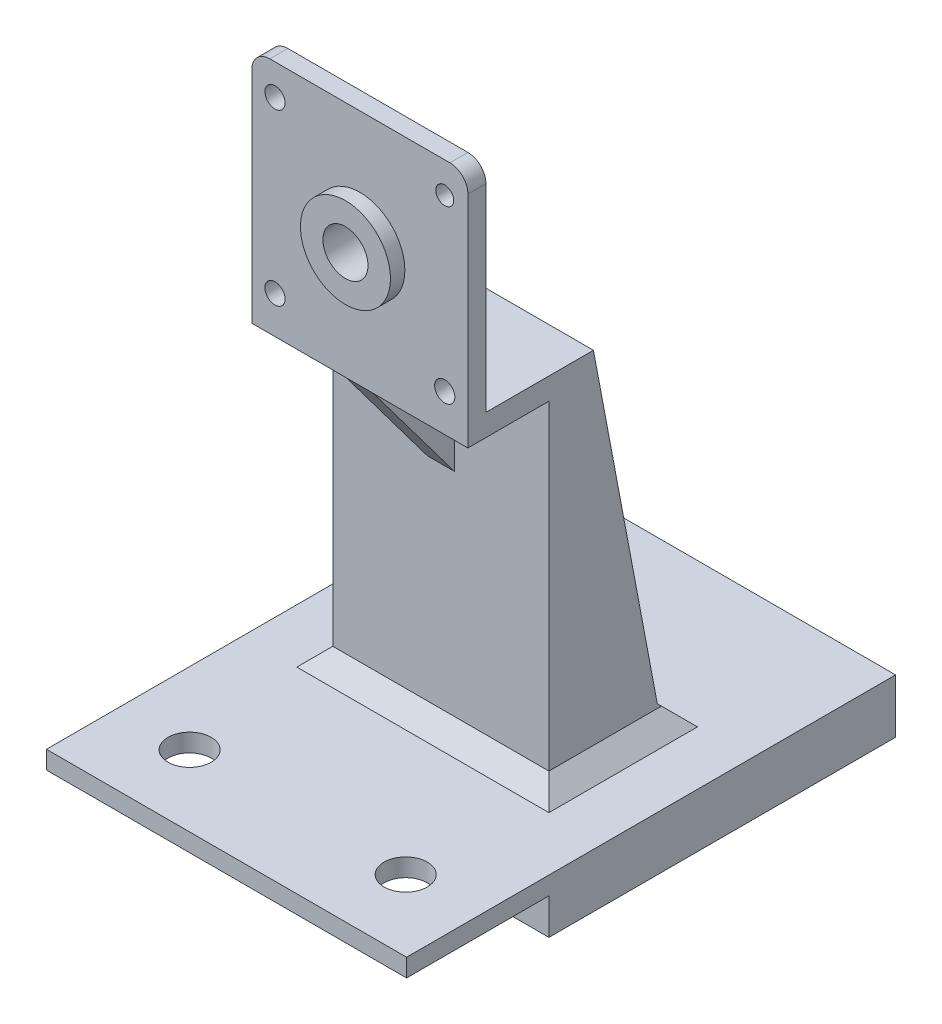
ISO-10303-21;
HEADER;
FILE_DESCRIPTION(('STEP AP214'),'2;1');
FILE_NAME('part.step','',(''),(''),'','','');
FILE_SCHEMA(('AUTOMOTIVE_DESIGN { 1 0 10303 214 1 1 1 1 }'));
ENDSEC;
DATA;
#1=APPLICATION_CONTEXT('core data for automotive mechanical design processes');
#2=APPLICATION_PROTOCOL_DEFINITION('international standard','automotive_design',2000,#1);
#3=PRODUCT_CONTEXT('',#1,'mechanical');
#4=PRODUCT('Part','Part','',(#3));
#5=PRODUCT_RELATED_PRODUCT_CATEGORY('part','',(#4));
#6=PRODUCT_DEFINITION_FORMATION('','',#4);
#7=PRODUCT_DEFINITION_CONTEXT('part definition',#1,'design');
#8=PRODUCT_DEFINITION('design','',#6,#7);
#9=PRODUCT_DEFINITION_SHAPE('','',#8);
#10=(LENGTH_UNIT() NAMED_UNIT(*) SI_UNIT(.MILLI.,.METRE.));
#11=(NAMED_UNIT(*) PLANE_ANGLE_UNIT() SI_UNIT($,.RADIAN.));
#12=(NAMED_UNIT(*) SI_UNIT($,.STERADIAN.) SOLID_ANGLE_UNIT());
#13=UNCERTAINTY_MEASURE_WITH_UNIT(LENGTH_MEASURE(1.E-05),#10,'distance_accuracy_value','');
#14=(GEOMETRIC_REPRESENTATION_CONTEXT(3) GLOBAL_UNCERTAINTY_ASSIGNED_CONTEXT((#13)) GLOBAL_UNIT_ASSIGNED_CONTEXT((#10,
#11,#12)) REPRESENTATION_CONTEXT('',''));
#15=CARTESIAN_POINT('',(0.,0.,0.));
#16=DIRECTION('',(0.,0.,1.));
#17=DIRECTION('',(1.,0.,0.));
#18=AXIS2_PLACEMENT_3D('',#15,#16,#17);
#19=CARTESIAN_POINT('',(-136.452860429321,217.859289709443,42.7777777777778));
#20=DIRECTION('',(0.,-1.,0.));
#21=DIRECTION('',(1.,0.,0.));
#22=AXIS2_PLACEMENT_3D('',#19,#20,#21);
#23=PLANE('',#22);
#24=DIRECTION('',(1.,0.,0.));
#25=VECTOR('',#24,1.);
#26=CARTESIAN_POINT('',(35.,217.859289709443,67.5));
#27=LINE('',#26,#25);
#28=CARTESIAN_POINT('',(-85.,217.859289709443,67.5));
#29=VERTEX_POINT('',#28);
#30=CARTESIAN_POINT('',(-32.5,217.859289709443,67.5));
#31=VERTEX_POINT('',#30);
#32=EDGE_CURVE('E218',#29,#31,#27,.T.);
#33=ORIENTED_EDGE('',*,*,#32,.T.);
#34=DIRECTION('',(0.,0.,1.));
#35=VECTOR('',#34,1.);
#36=CARTESIAN_POINT('',(-32.5000000000001,217.859289709443,42.7777777777778));
#37=LINE('',#36,#35);
#38=CARTESIAN_POINT('',(-32.5,217.859289709444,112.486640647303));
#39=VERTEX_POINT('',#38);
#40=EDGE_CURVE('E208',#31,#39,#37,.T.);
#41=ORIENTED_EDGE('',*,*,#40,.T.);
#42=DIRECTION('',(1.,0.,0.));
#43=VECTOR('',#42,1.);
#44=CARTESIAN_POINT('',(-218.602419857211,217.859289709443,112.486640647303));
#45=LINE('',#44,#43);
#46=CARTESIAN_POINT('',(-85.,217.859289709443,112.486640647303));
#47=VERTEX_POINT('',#46);
#48=EDGE_CURVE('E202',#47,#39,#45,.T.);
#49=ORIENTED_EDGE('',*,*,#48,.F.);
#50=DIRECTION('',(0.,0.,1.));
#51=VECTOR('',#50,1.);
#52=CARTESIAN_POINT('',(-85.,217.859289709443,42.7777777777778));
#53=LINE('',#52,#51);
#54=EDGE_CURVE('E253',#29,#47,#53,.T.);
#55=ORIENTED_EDGE('',*,*,#54,.F.);
#56=EDGE_LOOP('',(#33,#41,#49,#55));
#57=FACE_BOUND('',#56,.T.);
#58=ADVANCED_FACE('F45',(#57),#23,.T.);
#59=CARTESIAN_POINT('',(35.,0.,67.5));
#60=DIRECTION('',(0.,0.,1.));
#61=DIRECTION('',(1.,0.,0.));
#62=AXIS2_PLACEMENT_3D('',#59,#60,#61);
#63=PLANE('',#62);
#64=DIRECTION('',(0.,1.,0.));
#65=VECTOR('',#64,1.);
#66=CARTESIAN_POINT('',(-17.5000000000001,0.,67.5));
#67=LINE('',#66,#65);
#68=CARTESIAN_POINT('',(-17.5000000000001,157.859289709444,67.5));
#69=VERTEX_POINT('',#68);
#70=CARTESIAN_POINT('',(-17.5000000000001,217.859289709443,67.5));
#71=VERTEX_POINT('',#70);
#72=EDGE_CURVE('E505',#69,#71,#67,.T.);
#73=ORIENTED_EDGE('',*,*,#72,.F.);
#74=DIRECTION('',(1.,0.,0.));
#75=VECTOR('',#74,1.);
#76=CARTESIAN_POINT('',(35.,157.859289709443,67.5));
#77=LINE('',#76,#75);
#78=CARTESIAN_POINT('',(-32.5000000000001,157.859289709444,67.5));
#79=VERTEX_POINT('',#78);
#80=EDGE_CURVE('E502',#79,#69,#77,.T.);
#81=ORIENTED_EDGE('',*,*,#80,.F.);
#82=DIRECTION('',(0.,1.,0.));
#83=VECTOR('',#82,1.);
#84=CARTESIAN_POINT('',(-32.5000000000001,0.,67.5));
#85=LINE('',#84,#83);
#86=EDGE_CURVE('E210',#79,#31,#85,.T.);
#87=ORIENTED_EDGE('',*,*,#86,.T.);
#88=ORIENTED_EDGE('',*,*,#32,.F.);
#89=DIRECTION('',(0.,1.,0.));
#90=VECTOR('',#89,1.);
#91=CARTESIAN_POINT('',(-85.,0.,67.5));
#92=LINE('',#91,#90);
#93=CARTESIAN_POINT('',(-85.,40.0000000000001,67.5));
#94=VERTEX_POINT('',#93);
#95=EDGE_CURVE('E268',#94,#29,#92,.T.);
#96=ORIENTED_EDGE('',*,*,#95,.F.);
#97=DIRECTION('',(1.,0.,0.));
#98=VECTOR('',#97,1.);
#99=CARTESIAN_POINT('',(35.,40.0000000000001,67.5));
#100=LINE('',#99,#98);
#101=CARTESIAN_POINT('',(35.,40.0000000000001,67.5));
#102=VERTEX_POINT('',#101);
#103=EDGE_CURVE('E388',#94,#102,#100,.T.);
#104=ORIENTED_EDGE('',*,*,#103,.T.);
#105=DIRECTION('',(0.,1.,0.));
#106=VECTOR('',#105,1.);
#107=CARTESIAN_POINT('',(35.,0.,67.5));
#108=LINE('',#107,#106);
#109=CARTESIAN_POINT('',(34.9999999999999,217.859289709443,67.5));
#110=VERTEX_POINT('',#109);
#111=EDGE_CURVE('E272',#102,#110,#108,.T.);
#112=ORIENTED_EDGE('',*,*,#111,.T.);
#113=EDGE_CURVE('E256',#71,#110,#27,.T.);
#114=ORIENTED_EDGE('',*,*,#113,.F.);
#115=EDGE_LOOP('',(#73,#81,#87,#88,#96,#104,#112,#114));
#116=FACE_BOUND('',#115,.T.);
#117=ADVANCED_FACE('F536',(#116),#63,.T.);
#118=CARTESIAN_POINT('',(0.,30.,0.));
#119=DIRECTION('',(0.,1.,0.));
#120=DIRECTION('',(0.,0.,1.));
#121=AXIS2_PLACEMENT_3D('',#118,#119,#120);
#122=PLANE('',#121);
#123=DIRECTION('',(-1.,0.,0.));
#124=VECTOR('',#123,1.);
#125=CARTESIAN_POINT('',(-125.,30.,-85.));
#126=LINE('',#125,#124);
#127=CARTESIAN_POINT('',(75.,30.,-85.));
#128=VERTEX_POINT('',#127);
#129=CARTESIAN_POINT('',(-125.,30.,-85.));
#130=VERTEX_POINT('',#129);
#131=EDGE_CURVE('E291',#128,#130,#126,.T.);
#132=ORIENTED_EDGE('',*,*,#131,.T.);
#133=DIRECTION('',(0.,0.,1.));
#134=VECTOR('',#133,1.);
#135=CARTESIAN_POINT('',(-125.,30.,85.));
#136=LINE('',#135,#134);
#137=CARTESIAN_POINT('',(-125.,30.,186.536616743922));
#138=VERTEX_POINT('',#137);
#139=EDGE_CURVE('E315',#130,#138,#136,.T.);
#140=ORIENTED_EDGE('',*,*,#139,.T.);
#141=DIRECTION('',(1.,0.,0.));
#142=VECTOR('',#141,1.);
#143=CARTESIAN_POINT('',(-125.,30.,186.536616743922));
#144=LINE('',#143,#142);
#145=CARTESIAN_POINT('',(75.,30.,186.536616743922));
#146=VERTEX_POINT('',#145);
#147=EDGE_CURVE('E319',#138,#146,#144,.T.);
#148=ORIENTED_EDGE('',*,*,#147,.T.);
#149=DIRECTION('',(0.,0.,-1.));
#150=VECTOR('',#149,1.);
#151=CARTESIAN_POINT('',(75.,30.,85.));
#152=LINE('',#151,#150);
#153=EDGE_CURVE('E311',#146,#128,#152,.T.);
#154=ORIENTED_EDGE('',*,*,#153,.T.);
#155=EDGE_LOOP('',(#132,#140,#148,#154));
#156=FACE_BOUND('',#155,.T.);
#157=DIRECTION('',(0.,0.,-1.));
#158=VECTOR('',#157,1.);
#159=CARTESIAN_POINT('',(-95.,30.,0.));
#160=LINE('',#159,#158);
#161=CARTESIAN_POINT('',(-95.,30.,77.5));
#162=VERTEX_POINT('',#161);
#163=CARTESIAN_POINT('',(-95.,30.,-4.99999999999995));
#164=VERTEX_POINT('',#163);
#165=EDGE_CURVE('E378',#162,#164,#160,.T.);
#166=ORIENTED_EDGE('',*,*,#165,.T.);
#167=DIRECTION('',(1.,0.,0.));
#168=VECTOR('',#167,1.);
#169=CARTESIAN_POINT('',(0.,30.,-4.99999999999997));
#170=LINE('',#169,#168);
#171=CARTESIAN_POINT('',(44.9999999999999,30.,-4.99999999999998));
#172=VERTEX_POINT('',#171);
#173=EDGE_CURVE('E381',#164,#172,#170,.T.);
#174=ORIENTED_EDGE('',*,*,#173,.T.);
#175=DIRECTION('',(0.,0.,1.));
#176=VECTOR('',#175,1.);
#177=CARTESIAN_POINT('',(44.9999999999999,30.,67.5));
#178=LINE('',#177,#176);
#179=CARTESIAN_POINT('',(44.9999999999999,30.,77.5));
#180=VERTEX_POINT('',#179);
#181=EDGE_CURVE('E372',#172,#180,#178,.T.);
#182=ORIENTED_EDGE('',*,*,#181,.T.);
#183=DIRECTION('',(-1.,0.,0.));
#184=VECTOR('',#183,1.);
#185=CARTESIAN_POINT('',(-85.,30.,77.5));
#186=LINE('',#185,#184);
#187=EDGE_CURVE('E375',#180,#162,#186,.T.);
#188=ORIENTED_EDGE('',*,*,#187,.T.);
#189=EDGE_LOOP('',(#166,#174,#182,#188));
#190=FACE_BOUND('',#189,.T.);
#191=CARTESIAN_POINT('',(35.,30.,147.018308371961));
#192=DIRECTION('',(0.,1.,0.));
#193=DIRECTION('',(0.,0.,1.));
#194=AXIS2_PLACEMENT_3D('',#191,#192,#193);
#195=CIRCLE('',#194,12.);
#196=CARTESIAN_POINT('',(35.,30.,159.018308371961));
#197=VERTEX_POINT('',#196);
#198=EDGE_CURVE('E303',#197,#197,#195,.T.);
#199=ORIENTED_EDGE('',*,*,#198,.F.);
#200=EDGE_LOOP('',(#199));
#201=FACE_BOUND('',#200,.T.);
#202=CARTESIAN_POINT('',(-85.0000000000001,30.,147.018308371961));
#203=DIRECTION('',(0.,1.,0.));
#204=DIRECTION('',(0.,0.,1.));
#205=AXIS2_PLACEMENT_3D('',#202,#203,#204);
#206=CIRCLE('',#205,12.);
#207=CARTESIAN_POINT('',(-85.0000000000001,30.,159.018308371961));
#208=VERTEX_POINT('',#207);
#209=EDGE_CURVE('E295',#208,#208,#206,.T.);
#210=ORIENTED_EDGE('',*,*,#209,.F.);
#211=EDGE_LOOP('',(#210));
#212=FACE_BOUND('',#211,.T.);
#213=ADVANCED_FACE('F541',(#156,#190,#201,#212),#122,.T.);
#214=CARTESIAN_POINT('',(-125.,0.,-85.));
#215=DIRECTION('',(-1.,0.,0.));
#216=DIRECTION('',(0.,0.,1.));
#217=AXIS2_PLACEMENT_3D('',#214,#215,#216);
#218=PLANE('',#217);
#219=ORIENTED_EDGE('',*,*,#139,.F.);
#220=DIRECTION('',(0.,1.,0.));
#221=VECTOR('',#220,1.);
#222=CARTESIAN_POINT('',(-125.,0.,-85.));
#223=LINE('',#222,#221);
#224=CARTESIAN_POINT('',(-125.,0.,-85.));
#225=VERTEX_POINT('',#224);
#226=EDGE_CURVE('E359',#225,#130,#223,.T.);
#227=ORIENTED_EDGE('',*,*,#226,.F.);
#228=DIRECTION('',(0.,0.,1.));
#229=VECTOR('',#228,1.);
#230=CARTESIAN_POINT('',(-125.,0.,-85.));
#231=LINE('',#230,#229);
#232=CARTESIAN_POINT('',(-125.,0.,107.5));
#233=VERTEX_POINT('',#232);
#234=EDGE_CURVE('E350',#225,#233,#231,.T.);
#235=ORIENTED_EDGE('',*,*,#234,.T.);
#236=DIRECTION('',(0.,1.,0.));
#237=VECTOR('',#236,1.);
#238=CARTESIAN_POINT('',(-125.,0.,107.5));
#239=LINE('',#238,#237);
#240=CARTESIAN_POINT('',(-125.,20.,107.5));
#241=VERTEX_POINT('',#240);
#242=EDGE_CURVE('E343',#233,#241,#239,.T.);
#243=ORIENTED_EDGE('',*,*,#242,.T.);
#244=DIRECTION('',(0.,0.,1.));
#245=VECTOR('',#244,1.);
#246=CARTESIAN_POINT('',(-125.,20.,85.));
#247=LINE('',#246,#245);
#248=CARTESIAN_POINT('',(-125.,20.,186.536616743922));
#249=VERTEX_POINT('',#248);
#250=EDGE_CURVE('E326',#241,#249,#247,.T.);
#251=ORIENTED_EDGE('',*,*,#250,.T.);
#252=DIRECTION('',(0.,-1.,0.));
#253=VECTOR('',#252,1.);
#254=CARTESIAN_POINT('',(-125.,30.,186.536616743922));
#255=LINE('',#254,#253);
#256=EDGE_CURVE('E334',#138,#249,#255,.T.);
#257=ORIENTED_EDGE('',*,*,#256,.F.);
#258=EDGE_LOOP('',(#219,#227,#235,#243,#251,#257));
#259=FACE_BOUND('',#258,.T.);
#260=ADVANCED_FACE('F688',(#259),#218,.T.);
#261=CARTESIAN_POINT('',(-125.,0.,-85.));
#262=DIRECTION('',(0.,0.,-1.));
#263=DIRECTION('',(-1.,0.,0.));
#264=AXIS2_PLACEMENT_3D('',#261,#262,#263);
#265=PLANE('',#264);
#266=DIRECTION('',(-1.,0.,0.));
#267=VECTOR('',#266,1.);
#268=CARTESIAN_POINT('',(-125.,0.,-85.));
#269=LINE('',#268,#267);
#270=CARTESIAN_POINT('',(75.,0.,-85.));
#271=VERTEX_POINT('',#270);
#272=EDGE_CURVE('E355',#271,#225,#269,.T.);
#273=ORIENTED_EDGE('',*,*,#272,.T.);
#274=ORIENTED_EDGE('',*,*,#226,.T.);
#275=ORIENTED_EDGE('',*,*,#131,.F.);
#276=DIRECTION('',(0.,1.,0.));
#277=VECTOR('',#276,1.);
#278=CARTESIAN_POINT('',(75.,0.,-85.));
#279=LINE('',#278,#277);
#280=EDGE_CURVE('E358',#271,#128,#279,.T.);
#281=ORIENTED_EDGE('',*,*,#280,.F.);
#282=EDGE_LOOP('',(#273,#274,#275,#281));
#283=FACE_BOUND('',#282,.T.);
#284=ADVANCED_FACE('F682',(#283),#265,.T.);
#285=CARTESIAN_POINT('',(75.,20.,-75.));
#286=DIRECTION('',(-1.,0.,0.));
#287=DIRECTION('',(0.,0.,1.));
#288=AXIS2_PLACEMENT_3D('',#285,#286,#287);
#289=PLANE('',#288);
#290=ORIENTED_EDGE('',*,*,#280,.T.);
#291=ORIENTED_EDGE('',*,*,#153,.F.);
#292=DIRECTION('',(0.,-1.,0.));
#293=VECTOR('',#292,1.);
#294=CARTESIAN_POINT('',(75.,30.,186.536616743922));
#295=LINE('',#294,#293);
#296=CARTESIAN_POINT('',(75.,20.,186.536616743922));
#297=VERTEX_POINT('',#296);
#298=EDGE_CURVE('E322',#146,#297,#295,.T.);
#299=ORIENTED_EDGE('',*,*,#298,.T.);
#300=DIRECTION('',(0.,0.,-1.));
#301=VECTOR('',#300,1.);
#302=CARTESIAN_POINT('',(75.,20.,85.));
#303=LINE('',#302,#301);
#304=CARTESIAN_POINT('',(75.,20.,107.5));
#305=VERTEX_POINT('',#304);
#306=EDGE_CURVE('E307',#297,#305,#303,.T.);
#307=ORIENTED_EDGE('',*,*,#306,.T.);
#308=DIRECTION('',(0.,1.,0.));
#309=VECTOR('',#308,1.);
#310=CARTESIAN_POINT('',(75.,0.,107.5));
#311=LINE('',#310,#309);
#312=CARTESIAN_POINT('',(75.,0.,107.5));
#313=VERTEX_POINT('',#312);
#314=EDGE_CURVE('E347',#313,#305,#311,.T.);
#315=ORIENTED_EDGE('',*,*,#314,.F.);
#316=DIRECTION('',(0.,0.,-1.));
#317=VECTOR('',#316,1.);
#318=CARTESIAN_POINT('',(75.,0.,-75.));
#319=LINE('',#318,#317);
#320=EDGE_CURVE('E363',#313,#271,#319,.T.);
#321=ORIENTED_EDGE('',*,*,#320,.T.);
#322=EDGE_LOOP('',(#290,#291,#299,#307,#315,#321));
#323=FACE_BOUND('',#322,.T.);
#324=ADVANCED_FACE('F678',(#323),#289,.F.);
#325=CARTESIAN_POINT('',(0.,0.,0.));
#326=DIRECTION('',(0.,1.,0.));
#327=DIRECTION('',(0.,0.,1.));
#328=AXIS2_PLACEMENT_3D('',#325,#326,#327);
#329=PLANE('',#328);
#330=ORIENTED_EDGE('',*,*,#234,.F.);
#331=ORIENTED_EDGE('',*,*,#272,.F.);
#332=ORIENTED_EDGE('',*,*,#320,.F.);
#333=DIRECTION('',(1.,0.,0.));
#334=VECTOR('',#333,1.);
#335=CARTESIAN_POINT('',(-125.,0.,107.5));
#336=LINE('',#335,#334);
#337=EDGE_CURVE('E339',#233,#313,#336,.T.);
#338=ORIENTED_EDGE('',*,*,#337,.F.);
#339=EDGE_LOOP('',(#330,#331,#332,#338));
#340=FACE_BOUND('',#339,.T.);
#341=ADVANCED_FACE('F681',(#340),#329,.F.);
#342=CARTESIAN_POINT('',(-125.,0.,107.5));
#343=DIRECTION('',(0.,0.,1.));
#344=DIRECTION('',(1.,0.,0.));
#345=AXIS2_PLACEMENT_3D('',#342,#343,#344);
#346=PLANE('',#345);
#347=DIRECTION('',(1.,0.,0.));
#348=VECTOR('',#347,1.);
#349=CARTESIAN_POINT('',(-125.,20.,107.5));
#350=LINE('',#349,#348);
#351=EDGE_CURVE('E338',#241,#305,#350,.T.);
#352=ORIENTED_EDGE('',*,*,#351,.F.);
#353=ORIENTED_EDGE('',*,*,#242,.F.);
#354=ORIENTED_EDGE('',*,*,#337,.T.);
#355=ORIENTED_EDGE('',*,*,#314,.T.);
#356=EDGE_LOOP('',(#352,#353,#354,#355));
#357=FACE_BOUND('',#356,.T.);
#358=ADVANCED_FACE('F686',(#357),#346,.T.);
#359=CARTESIAN_POINT('',(0.,20.,0.));
#360=DIRECTION('',(0.,1.,0.));
#361=DIRECTION('',(0.,0.,1.));
#362=AXIS2_PLACEMENT_3D('',#359,#360,#361);
#363=PLANE('',#362);
#364=CARTESIAN_POINT('',(35.,20.,147.018308371961));
#365=DIRECTION('',(0.,1.,0.));
#366=DIRECTION('',(0.,0.,1.));
#367=AXIS2_PLACEMENT_3D('',#364,#365,#366);
#368=CIRCLE('',#367,12.);
#369=CARTESIAN_POINT('',(35.,20.,159.018308371961));
#370=VERTEX_POINT('',#369);
#371=EDGE_CURVE('E299',#370,#370,#368,.T.);
#372=ORIENTED_EDGE('',*,*,#371,.T.);
#373=EDGE_LOOP('',(#372));
#374=FACE_BOUND('',#373,.T.);
#375=CARTESIAN_POINT('',(-85.0000000000001,20.,147.018308371961));
#376=DIRECTION('',(0.,1.,0.));
#377=DIRECTION('',(0.,0.,1.));
#378=AXIS2_PLACEMENT_3D('',#375,#376,#377);
#379=CIRCLE('',#378,12.);
#380=CARTESIAN_POINT('',(-85.0000000000001,20.,159.018308371961));
#381=VERTEX_POINT('',#380);
#382=EDGE_CURVE('E294',#381,#381,#379,.T.);
#383=ORIENTED_EDGE('',*,*,#382,.T.);
#384=EDGE_LOOP('',(#383));
#385=FACE_BOUND('',#384,.T.);
#386=ORIENTED_EDGE('',*,*,#250,.F.);
#387=ORIENTED_EDGE('',*,*,#351,.T.);
#388=ORIENTED_EDGE('',*,*,#306,.F.);
#389=DIRECTION('',(1.,0.,0.));
#390=VECTOR('',#389,1.);
#391=CARTESIAN_POINT('',(-125.,20.,186.536616743922));
#392=LINE('',#391,#390);
#393=EDGE_CURVE('E316',#249,#297,#392,.T.);
#394=ORIENTED_EDGE('',*,*,#393,.F.);
#395=EDGE_LOOP('',(#386,#387,#388,#394));
#396=FACE_BOUND('',#395,.T.);
#397=ADVANCED_FACE('F697',(#374,#385,#396),#363,.F.);
#398=CARTESIAN_POINT('',(-125.,30.,186.536616743922));
#399=DIRECTION('',(0.,0.,-1.));
#400=DIRECTION('',(-1.,0.,0.));
#401=AXIS2_PLACEMENT_3D('',#398,#399,#400);
#402=PLANE('',#401);
#403=ORIENTED_EDGE('',*,*,#393,.T.);
#404=ORIENTED_EDGE('',*,*,#298,.F.);
#405=ORIENTED_EDGE('',*,*,#147,.F.);
#406=ORIENTED_EDGE('',*,*,#256,.T.);
#407=EDGE_LOOP('',(#403,#404,#405,#406));
#408=FACE_BOUND('',#407,.T.);
#409=ADVANCED_FACE('F699',(#408),#402,.F.);
#410=CARTESIAN_POINT('',(35.,30.,147.018308371961));
#411=DIRECTION('',(0.,-1.,0.));
#412=DIRECTION('',(0.,0.,-1.));
#413=AXIS2_PLACEMENT_3D('',#410,#411,#412);
#414=CYLINDRICAL_SURFACE('',#413,12.);
#415=ORIENTED_EDGE('',*,*,#198,.T.);
#416=EDGE_LOOP('',(#415));
#417=FACE_BOUND('',#416,.T.);
#418=ORIENTED_EDGE('',*,*,#371,.F.);
#419=EDGE_LOOP('',(#418));
#420=FACE_BOUND('',#419,.T.);
#421=ADVANCED_FACE('F702',(#417,#420),#414,.F.);
#422=CARTESIAN_POINT('',(-85.0000000000001,30.,147.018308371961));
#423=DIRECTION('',(0.,-1.,0.));
#424=DIRECTION('',(0.,0.,-1.));
#425=AXIS2_PLACEMENT_3D('',#422,#423,#424);
#426=CYLINDRICAL_SURFACE('',#425,12.);
#427=ORIENTED_EDGE('',*,*,#209,.T.);
#428=EDGE_LOOP('',(#427));
#429=FACE_BOUND('',#428,.T.);
#430=ORIENTED_EDGE('',*,*,#382,.F.);
#431=EDGE_LOOP('',(#430));
#432=FACE_BOUND('',#431,.T.);
#433=ADVANCED_FACE('F712',(#429,#432),#426,.F.);
#434=CARTESIAN_POINT('',(34.9999999999999,0.121587793539158,-0.643700083442605));
#435=DIRECTION('',(0.,-0.185606774758075,0.982624101660398));
#436=DIRECTION('',(0.,-0.982624101660399,-0.185606774758075));
#437=AXIS2_PLACEMENT_3D('',#434,#435,#436);
#438=PLANE('',#437);
#439=DIRECTION('',(0.,0.982624101660398,0.185606774758075));
#440=VECTOR('',#439,1.);
#441=CARTESIAN_POINT('',(-85.0000000000001,0.121587793539158,-0.643700083442584));
#442=LINE('',#441,#440);
#443=CARTESIAN_POINT('',(-85.0000000000001,42.3287671232878,7.32876712328771));
#444=VERTEX_POINT('',#443);
#445=CARTESIAN_POINT('',(-85.,230.,42.7777777777778));
#446=VERTEX_POINT('',#445);
#447=EDGE_CURVE('E277',#444,#446,#442,.T.);
#448=ORIENTED_EDGE('',*,*,#447,.T.);
#449=DIRECTION('',(-1.,0.,0.));
#450=VECTOR('',#449,1.);
#451=CARTESIAN_POINT('',(35.,230.,42.7777777777778));
#452=LINE('',#451,#450);
#453=CARTESIAN_POINT('',(35.,230.,42.7777777777778));
#454=VERTEX_POINT('',#453);
#455=EDGE_CURVE('E276',#454,#446,#452,.T.);
#456=ORIENTED_EDGE('',*,*,#455,.F.);
#457=DIRECTION('',(0.,0.982624101660398,0.185606774758075));
#458=VECTOR('',#457,1.);
#459=CARTESIAN_POINT('',(34.9999999999999,0.121587793539158,-0.643700083442605));
#460=LINE('',#459,#458);
#461=CARTESIAN_POINT('',(34.9999999999999,42.3287671232878,7.32876712328769));
#462=VERTEX_POINT('',#461);
#463=EDGE_CURVE('E264',#462,#454,#460,.T.);
#464=ORIENTED_EDGE('',*,*,#463,.F.);
#465=DIRECTION('',(-1.,0.,0.));
#466=VECTOR('',#465,1.);
#467=CARTESIAN_POINT('',(34.9999999999999,42.3287671232878,7.32876712328769));
#468=LINE('',#467,#466);
#469=EDGE_CURVE('E368',#462,#444,#468,.T.);
#470=ORIENTED_EDGE('',*,*,#469,.T.);
#471=EDGE_LOOP('',(#448,#456,#464,#470));
#472=FACE_BOUND('',#471,.T.);
#473=ADVANCED_FACE('F636',(#472),#438,.F.);
#474=CARTESIAN_POINT('',(34.9999999999999,230.,0.));
#475=DIRECTION('',(0.,1.,0.));
#476=DIRECTION('',(0.,0.,1.));
#477=AXIS2_PLACEMENT_3D('',#474,#475,#476);
#478=PLANE('',#477);
#479=ORIENTED_EDGE('',*,*,#455,.T.);
#480=DIRECTION('',(0.,0.,-1.));
#481=VECTOR('',#480,1.);
#482=CARTESIAN_POINT('',(-85.0000000000001,230.,0.));
#483=LINE('',#482,#481);
#484=CARTESIAN_POINT('',(-85.,230.,102.486640647303));
#485=VERTEX_POINT('',#484);
#486=EDGE_CURVE('E281',#485,#446,#483,.T.);
#487=ORIENTED_EDGE('',*,*,#486,.F.);
#488=DIRECTION('',(1.,0.,0.));
#489=VECTOR('',#488,1.);
#490=CARTESIAN_POINT('',(-218.602419857211,230.,102.486640647303));
#491=LINE('',#490,#489);
#492=CARTESIAN_POINT('',(35.,230.,102.486640647303));
#493=VERTEX_POINT('',#492);
#494=EDGE_CURVE('E247',#485,#493,#491,.T.);
#495=ORIENTED_EDGE('',*,*,#494,.T.);
#496=DIRECTION('',(0.,0.,-1.));
#497=VECTOR('',#496,1.);
#498=CARTESIAN_POINT('',(34.9999999999999,230.,0.));
#499=LINE('',#498,#497);
#500=EDGE_CURVE('E267',#493,#454,#499,.T.);
#501=ORIENTED_EDGE('',*,*,#500,.T.);
#502=EDGE_LOOP('',(#479,#487,#495,#501));
#503=FACE_BOUND('',#502,.T.);
#504=ADVANCED_FACE('F640',(#503),#478,.T.);
#505=CARTESIAN_POINT('',(34.9999999999999,0.,0.));
#506=DIRECTION('',(1.,0.,0.));
#507=DIRECTION('',(0.,0.,-1.));
#508=AXIS2_PLACEMENT_3D('',#505,#506,#507);
#509=PLANE('',#508);
#510=DIRECTION('',(0.,1.,0.));
#511=VECTOR('',#510,1.);
#512=CARTESIAN_POINT('',(35.,230.,102.486640647303));
#513=LINE('',#512,#511);
#514=CARTESIAN_POINT('',(35.,340.,102.486640647303));
#515=VERTEX_POINT('',#514);
#516=EDGE_CURVE('E432',#493,#515,#513,.T.);
#517=ORIENTED_EDGE('',*,*,#516,.T.);
#518=DIRECTION('',(0.,0.,1.));
#519=VECTOR('',#518,1.);
#520=CARTESIAN_POINT('',(34.9999999999999,340.,0.));
#521=LINE('',#520,#519);
#522=CARTESIAN_POINT('',(35.,340.,112.486640647303));
#523=VERTEX_POINT('',#522);
#524=EDGE_CURVE('E401',#515,#523,#521,.T.);
#525=ORIENTED_EDGE('',*,*,#524,.T.);
#526=DIRECTION('',(0.,-1.,0.));
#527=VECTOR('',#526,1.);
#528=CARTESIAN_POINT('',(35.,230.,112.486640647303));
#529=LINE('',#528,#527);
#530=CARTESIAN_POINT('',(35.,217.859289709443,112.486640647303));
#531=VERTEX_POINT('',#530);
#532=EDGE_CURVE('E252',#523,#531,#529,.T.);
#533=ORIENTED_EDGE('',*,*,#532,.T.);
#534=DIRECTION('',(0.,0.,-1.));
#535=VECTOR('',#534,1.);
#536=CARTESIAN_POINT('',(34.9999999999999,217.859289709443,42.7777777777778));
#537=LINE('',#536,#535);
#538=EDGE_CURVE('E257',#531,#110,#537,.T.);
#539=ORIENTED_EDGE('',*,*,#538,.T.);
#540=ORIENTED_EDGE('',*,*,#111,.F.);
#541=DIRECTION('',(0.,0.,-1.));
#542=VECTOR('',#541,1.);
#543=CARTESIAN_POINT('',(34.9999999999999,40.0000000000001,5.));
#544=LINE('',#543,#542);
#545=CARTESIAN_POINT('',(34.9999999999999,40.0000000000001,5.));
#546=VERTEX_POINT('',#545);
#547=EDGE_CURVE('E391',#102,#546,#544,.T.);
#548=ORIENTED_EDGE('',*,*,#547,.T.);
#549=DIRECTION('',(0.,0.707106781186551,0.707106781186544));
#550=VECTOR('',#549,1.);
#551=CARTESIAN_POINT('',(34.9999999999999,42.3287671232878,7.32876712328769));
#552=LINE('',#551,#550);
#553=EDGE_CURVE('E398',#546,#462,#552,.T.);
#554=ORIENTED_EDGE('',*,*,#553,.T.);
#555=ORIENTED_EDGE('',*,*,#463,.T.);
#556=ORIENTED_EDGE('',*,*,#500,.F.);
#557=EDGE_LOOP('',(#517,#525,#533,#539,#540,#548,#554,#555,#556));
#558=FACE_BOUND('',#557,.T.);
#559=ADVANCED_FACE('F464',(#558),#509,.T.);
#560=CARTESIAN_POINT('',(-85.0000000000001,0.,0.));
#561=DIRECTION('',(1.,0.,0.));
#562=DIRECTION('',(0.,0.,-1.));
#563=AXIS2_PLACEMENT_3D('',#560,#561,#562);
#564=PLANE('',#563);
#565=DIRECTION('',(0.,1.,0.));
#566=VECTOR('',#565,1.);
#567=CARTESIAN_POINT('',(-85.,230.,112.486640647303));
#568=LINE('',#567,#566);
#569=CARTESIAN_POINT('',(-85.,340.,112.486640647303));
#570=VERTEX_POINT('',#569);
#571=EDGE_CURVE('E225',#47,#570,#568,.T.);
#572=ORIENTED_EDGE('',*,*,#571,.T.);
#573=DIRECTION('',(0.,0.,-1.));
#574=VECTOR('',#573,1.);
#575=CARTESIAN_POINT('',(-85.,340.,102.486640647303));
#576=LINE('',#575,#574);
#577=CARTESIAN_POINT('',(-85.,340.,102.486640647303));
#578=VERTEX_POINT('',#577);
#579=EDGE_CURVE('E11',#570,#578,#576,.T.);
#580=ORIENTED_EDGE('',*,*,#579,.T.);
#581=DIRECTION('',(0.,-1.,0.));
#582=VECTOR('',#581,1.);
#583=CARTESIAN_POINT('',(-85.,230.,102.486640647303));
#584=LINE('',#583,#582);
#585=EDGE_CURVE('E227',#578,#485,#584,.T.);
#586=ORIENTED_EDGE('',*,*,#585,.T.);
#587=ORIENTED_EDGE('',*,*,#486,.T.);
#588=ORIENTED_EDGE('',*,*,#447,.F.);
#589=DIRECTION('',(0.,-0.707106781186551,-0.707106781186544));
#590=VECTOR('',#589,1.);
#591=CARTESIAN_POINT('',(-85.0000000000001,17.4999999999999,-17.5));
#592=LINE('',#591,#590);
#593=CARTESIAN_POINT('',(-85.0000000000001,40.0000000000001,5.00000000000002));
#594=VERTEX_POINT('',#593);
#595=EDGE_CURVE('E394',#444,#594,#592,.T.);
#596=ORIENTED_EDGE('',*,*,#595,.T.);
#597=DIRECTION('',(0.,0.,1.));
#598=VECTOR('',#597,1.);
#599=CARTESIAN_POINT('',(-85.0000000000001,40.0000000000001,0.));
#600=LINE('',#599,#598);
#601=EDGE_CURVE('E385',#594,#94,#600,.T.);
#602=ORIENTED_EDGE('',*,*,#601,.T.);
#603=ORIENTED_EDGE('',*,*,#95,.T.);
#604=ORIENTED_EDGE('',*,*,#54,.T.);
#605=EDGE_LOOP('',(#572,#580,#586,#587,#588,#596,#602,#603,#604));
#606=FACE_BOUND('',#605,.T.);
#607=ADVANCED_FACE('F643',(#606),#564,.F.);
#608=CARTESIAN_POINT('',(0.,30.,77.5));
#609=DIRECTION('',(0.,0.707106781186543,0.707106781186552));
#610=DIRECTION('',(1.,0.,0.));
#611=AXIS2_PLACEMENT_3D('',#608,#609,#610);
#612=PLANE('',#611);
#613=DIRECTION('',(0.577350269189624,0.57735026918963,-0.577350269189623));
#614=VECTOR('',#613,1.);
#615=CARTESIAN_POINT('',(-63.3333333333335,61.6666666666668,45.8333333333335));
#616=LINE('',#615,#614);
#617=EDGE_CURVE('E408',#162,#94,#616,.T.);
#618=ORIENTED_EDGE('',*,*,#617,.F.);
#619=ORIENTED_EDGE('',*,*,#187,.F.);
#620=DIRECTION('',(0.577350269189624,-0.57735026918963,0.577350269189623));
#621=VECTOR('',#620,1.);
#622=CARTESIAN_POINT('',(12.5000000000001,62.5000000000001,45.0000000000002));
#623=LINE('',#622,#621);
#624=EDGE_CURVE('E282',#102,#180,#623,.T.);
#625=ORIENTED_EDGE('',*,*,#624,.F.);
#626=ORIENTED_EDGE('',*,*,#103,.F.);
#627=EDGE_LOOP('',(#618,#619,#625,#626));
#628=FACE_BOUND('',#627,.T.);
#629=ADVANCED_FACE('F626',(#628),#612,.T.);
#630=CARTESIAN_POINT('',(34.9999999999999,40.0000000000001,0.));
#631=DIRECTION('',(0.707106781186551,0.707106781186544,0.));
#632=DIRECTION('',(0.,0.,1.));
#633=AXIS2_PLACEMENT_3D('',#630,#631,#632);
#634=PLANE('',#633);
#635=ORIENTED_EDGE('',*,*,#624,.T.);
#636=ORIENTED_EDGE('',*,*,#181,.F.);
#637=DIRECTION('',(0.577350269189623,-0.57735026918963,-0.577350269189625));
#638=VECTOR('',#637,1.);
#639=CARTESIAN_POINT('',(36.6666666666666,38.3333333333334,3.33333333333334));
#640=LINE('',#639,#638);
#641=EDGE_CURVE('E405',#546,#172,#640,.T.);
#642=ORIENTED_EDGE('',*,*,#641,.F.);
#643=ORIENTED_EDGE('',*,*,#547,.F.);
#644=EDGE_LOOP('',(#635,#636,#642,#643));
#645=FACE_BOUND('',#644,.T.);
#646=ADVANCED_FACE('F629',(#645),#634,.T.);
#647=CARTESIAN_POINT('',(-95.,30.,0.));
#648=DIRECTION('',(0.707106781186551,-0.707106781186544,0.));
#649=DIRECTION('',(0.,0.,-1.));
#650=AXIS2_PLACEMENT_3D('',#647,#648,#649);
#651=PLANE('',#650);
#652=ORIENTED_EDGE('',*,*,#601,.F.);
#653=DIRECTION('',(-0.577350269189624,-0.577350269189629,-0.577350269189624));
#654=VECTOR('',#653,1.);
#655=CARTESIAN_POINT('',(-93.3333333333334,31.6666666666667,-3.33333333333331));
#656=LINE('',#655,#654);
#657=EDGE_CURVE('E263',#164,#594,#656,.F.);
#658=ORIENTED_EDGE('',*,*,#657,.F.);
#659=ORIENTED_EDGE('',*,*,#165,.F.);
#660=ORIENTED_EDGE('',*,*,#617,.T.);
#661=EDGE_LOOP('',(#652,#658,#659,#660));
#662=FACE_BOUND('',#661,.T.);
#663=ADVANCED_FACE('F554',(#662),#651,.F.);
#664=CARTESIAN_POINT('',(34.9999999999999,42.3287671232878,7.32876712328769));
#665=DIRECTION('',(0.,-0.707106781186544,0.707106781186551));
#666=DIRECTION('',(-1.,0.,0.));
#667=AXIS2_PLACEMENT_3D('',#664,#665,#666);
#668=PLANE('',#667);
#669=ORIENTED_EDGE('',*,*,#641,.T.);
#670=ORIENTED_EDGE('',*,*,#173,.F.);
#671=ORIENTED_EDGE('',*,*,#657,.T.);
#672=ORIENTED_EDGE('',*,*,#595,.F.);
#673=ORIENTED_EDGE('',*,*,#469,.F.);
#674=ORIENTED_EDGE('',*,*,#553,.F.);
#675=EDGE_LOOP('',(#669,#670,#671,#672,#673,#674));
#676=FACE_BOUND('',#675,.T.);
#677=ADVANCED_FACE('F546',(#676),#668,.F.);
#678=DIRECTION('',(0.,0.,1.));
#679=VECTOR('',#678,1.);
#680=CARTESIAN_POINT('',(-17.5000000000001,217.859289709443,42.7777777777778));
#681=LINE('',#680,#679);
#682=CARTESIAN_POINT('',(-17.5,217.859289709443,112.486640647303));
#683=VERTEX_POINT('',#682);
#684=EDGE_CURVE('E508',#71,#683,#681,.T.);
#685=ORIENTED_EDGE('',*,*,#684,.F.);
#686=ORIENTED_EDGE('',*,*,#113,.T.);
#687=ORIENTED_EDGE('',*,*,#538,.F.);
#688=EDGE_CURVE('E203',#683,#531,#45,.T.);
#689=ORIENTED_EDGE('',*,*,#688,.F.);
#690=EDGE_LOOP('',(#685,#686,#687,#689));
#691=FACE_BOUND('',#690,.T.);
#692=ADVANCED_FACE('F537',(#691),#23,.T.);
#693=CARTESIAN_POINT('',(-218.602419857211,230.,112.486640647303));
#694=DIRECTION('',(0.,0.,1.));
#695=DIRECTION('',(1.,0.,0.));
#696=AXIS2_PLACEMENT_3D('',#693,#694,#695);
#697=PLANE('',#696);
#698=CARTESIAN_POINT('',(-24.999999134533,285.832995408971,112.486640647303));
#699=DIRECTION('',(0.,0.,1.));
#700=DIRECTION('',(1.,0.,0.));
#701=AXIS2_PLACEMENT_3D('',#698,#699,#700);
#702=CIRCLE('',#701,25.);
#703=CARTESIAN_POINT('',(8.65466996680109E-07,285.832995408971,112.486640647303));
#704=VERTEX_POINT('',#703);
#705=EDGE_CURVE('E491',#704,#704,#702,.T.);
#706=ORIENTED_EDGE('',*,*,#705,.F.);
#707=EDGE_LOOP('',(#706));
#708=FACE_BOUND('',#707,.T.);
#709=EDGE_CURVE('E194',#39,#683,#45,.T.);
#710=ORIENTED_EDGE('',*,*,#709,.T.);
#711=ORIENTED_EDGE('',*,*,#688,.T.);
#712=ORIENTED_EDGE('',*,*,#532,.F.);
#713=CARTESIAN_POINT('',(25.,340.,112.486640647303));
#714=DIRECTION('',(0.,0.,1.));
#715=DIRECTION('',(1.,0.,0.));
#716=AXIS2_PLACEMENT_3D('',#713,#714,#715);
#717=CIRCLE('',#716,10.);
#718=CARTESIAN_POINT('',(24.9999999999999,350.,112.486640647303));
#719=VERTEX_POINT('',#718);
#720=EDGE_CURVE('E439',#523,#719,#717,.T.);
#721=ORIENTED_EDGE('',*,*,#720,.T.);
#722=DIRECTION('',(1.,0.,0.));
#723=VECTOR('',#722,1.);
#724=CARTESIAN_POINT('',(-218.602419857211,350.,112.486640647303));
#725=LINE('',#724,#723);
#726=CARTESIAN_POINT('',(-75.,350.,112.486640647303));
#727=VERTEX_POINT('',#726);
#728=EDGE_CURVE('E234',#727,#719,#725,.T.);
#729=ORIENTED_EDGE('',*,*,#728,.F.);
#730=CARTESIAN_POINT('',(-75.0000000000001,340.,112.486640647303));
#731=DIRECTION('',(0.,0.,1.));
#732=DIRECTION('',(1.,0.,0.));
#733=AXIS2_PLACEMENT_3D('',#730,#731,#732);
#734=CIRCLE('',#733,10.);
#735=EDGE_CURVE('E436',#727,#570,#734,.T.);
#736=ORIENTED_EDGE('',*,*,#735,.T.);
#737=ORIENTED_EDGE('',*,*,#571,.F.);
#738=ORIENTED_EDGE('',*,*,#48,.T.);
#739=EDGE_LOOP('',(#710,#711,#712,#721,#729,#736,#737,#738));
#740=FACE_BOUND('',#739,.T.);
#741=CARTESIAN_POINT('',(22.1399999999999,238.66,112.486640647303));
#742=DIRECTION('',(0.,0.,1.));
#743=DIRECTION('',(1.,0.,0.));
#744=AXIS2_PLACEMENT_3D('',#741,#742,#743);
#745=CIRCLE('',#744,5.60000000000001);
#746=CARTESIAN_POINT('',(27.7399999999999,238.66,112.486640647303));
#747=VERTEX_POINT('',#746);
#748=EDGE_CURVE('E478',#747,#747,#745,.T.);
#749=ORIENTED_EDGE('',*,*,#748,.F.);
#750=EDGE_LOOP('',(#749));
#751=FACE_BOUND('',#750,.T.);
#752=CARTESIAN_POINT('',(22.1399999999999,332.94,112.486640647303));
#753=DIRECTION('',(0.,0.,1.));
#754=DIRECTION('',(1.,0.,0.));
#755=AXIS2_PLACEMENT_3D('',#752,#753,#754);
#756=CIRCLE('',#755,5.);
#757=CARTESIAN_POINT('',(27.1399999999999,332.94,112.486640647303));
#758=VERTEX_POINT('',#757);
#759=EDGE_CURVE('E420',#758,#758,#756,.T.);
#760=ORIENTED_EDGE('',*,*,#759,.F.);
#761=EDGE_LOOP('',(#760));
#762=FACE_BOUND('',#761,.T.);
#763=CARTESIAN_POINT('',(-72.1400000000001,238.66,112.486640647303));
#764=DIRECTION('',(0.,0.,1.));
#765=DIRECTION('',(1.,0.,0.));
#766=AXIS2_PLACEMENT_3D('',#763,#764,#765);
#767=CIRCLE('',#766,5.60000000000001);
#768=CARTESIAN_POINT('',(-66.5400000000001,238.66,112.486640647303));
#769=VERTEX_POINT('',#768);
#770=EDGE_CURVE('E483',#769,#769,#767,.T.);
#771=ORIENTED_EDGE('',*,*,#770,.F.);
#772=EDGE_LOOP('',(#771));
#773=FACE_BOUND('',#772,.T.);
#774=CARTESIAN_POINT('',(-72.1400000000001,332.94,112.486640647303));
#775=DIRECTION('',(0.,0.,1.));
#776=DIRECTION('',(1.,0.,0.));
#777=AXIS2_PLACEMENT_3D('',#774,#775,#776);
#778=CIRCLE('',#777,5.6);
#779=CARTESIAN_POINT('',(-66.5400000000001,332.94,112.486640647303));
#780=VERTEX_POINT('',#779);
#781=EDGE_CURVE('E479',#780,#780,#778,.T.);
#782=ORIENTED_EDGE('',*,*,#781,.F.);
#783=EDGE_LOOP('',(#782));
#784=FACE_BOUND('',#783,.T.);
#785=ADVANCED_FACE('F222',(#708,#740,#751,#762,#773,#784),#697,.T.);
#786=CARTESIAN_POINT('',(-218.602419857211,350.,102.486640647303));
#787=DIRECTION('',(0.,1.,0.));
#788=DIRECTION('',(-1.,0.,0.));
#789=AXIS2_PLACEMENT_3D('',#786,#787,#788);
#790=PLANE('',#789);
#791=DIRECTION('',(0.,0.,1.));
#792=VECTOR('',#791,1.);
#793=CARTESIAN_POINT('',(24.9999999999999,350.,102.486640647303));
#794=LINE('',#793,#792);
#795=CARTESIAN_POINT('',(24.9999999999999,350.,102.486640647303));
#796=VERTEX_POINT('',#795);
#797=EDGE_CURVE('E445',#719,#796,#794,.F.);
#798=ORIENTED_EDGE('',*,*,#797,.T.);
#799=DIRECTION('',(1.,0.,0.));
#800=VECTOR('',#799,1.);
#801=CARTESIAN_POINT('',(-218.602419857211,350.,102.486640647303));
#802=LINE('',#801,#800);
#803=CARTESIAN_POINT('',(-75.,350.,102.486640647303));
#804=VERTEX_POINT('',#803);
#805=EDGE_CURVE('E240',#804,#796,#802,.T.);
#806=ORIENTED_EDGE('',*,*,#805,.F.);
#807=DIRECTION('',(0.,0.,-1.));
#808=VECTOR('',#807,1.);
#809=CARTESIAN_POINT('',(-75.0000000000001,350.,112.486640647303));
#810=LINE('',#809,#808);
#811=EDGE_CURVE('E442',#804,#727,#810,.F.);
#812=ORIENTED_EDGE('',*,*,#811,.T.);
#813=ORIENTED_EDGE('',*,*,#728,.T.);
#814=EDGE_LOOP('',(#798,#806,#812,#813));
#815=FACE_BOUND('',#814,.T.);
#816=ADVANCED_FACE('F522',(#815),#790,.T.);
#817=CARTESIAN_POINT('',(-218.602419857211,230.,102.486640647303));
#818=DIRECTION('',(0.,0.,-1.));
#819=DIRECTION('',(-1.,0.,0.));
#820=AXIS2_PLACEMENT_3D('',#817,#818,#819);
#821=PLANE('',#820);
#822=CARTESIAN_POINT('',(-24.999999134533,285.832995408971,102.486640647303));
#823=DIRECTION('',(0.,0.,-1.));
#824=DIRECTION('',(-1.,0.,0.));
#825=AXIS2_PLACEMENT_3D('',#822,#823,#824);
#826=CIRCLE('',#825,12.5);
#827=CARTESIAN_POINT('',(-37.499999134533,285.832995408971,102.486640647303));
#828=VERTEX_POINT('',#827);
#829=EDGE_CURVE('E212',#828,#828,#826,.T.);
#830=ORIENTED_EDGE('',*,*,#829,.F.);
#831=EDGE_LOOP('',(#830));
#832=FACE_BOUND('',#831,.T.);
#833=ORIENTED_EDGE('',*,*,#516,.F.);
#834=ORIENTED_EDGE('',*,*,#494,.F.);
#835=ORIENTED_EDGE('',*,*,#585,.F.);
#836=CARTESIAN_POINT('',(-75.0000000000001,340.,102.486640647303));
#837=DIRECTION('',(0.,0.,-1.));
#838=DIRECTION('',(-1.,0.,0.));
#839=AXIS2_PLACEMENT_3D('',#836,#837,#838);
#840=CIRCLE('',#839,10.);
#841=EDGE_CURVE('E69',#578,#804,#840,.T.);
#842=ORIENTED_EDGE('',*,*,#841,.T.);
#843=ORIENTED_EDGE('',*,*,#805,.T.);
#844=CARTESIAN_POINT('',(25.,340.,102.486640647303));
#845=DIRECTION('',(0.,0.,-1.));
#846=DIRECTION('',(-1.,0.,0.));
#847=AXIS2_PLACEMENT_3D('',#844,#845,#846);
#848=CIRCLE('',#847,10.);
#849=EDGE_CURVE('E54',#796,#515,#848,.T.);
#850=ORIENTED_EDGE('',*,*,#849,.T.);
#851=EDGE_LOOP('',(#833,#834,#835,#842,#843,#850));
#852=FACE_BOUND('',#851,.T.);
#853=CARTESIAN_POINT('',(22.1399999999999,238.66,102.486640647303));
#854=DIRECTION('',(0.,0.,-1.));
#855=DIRECTION('',(-1.,0.,0.));
#856=AXIS2_PLACEMENT_3D('',#853,#854,#855);
#857=CIRCLE('',#856,5.60000000000001);
#858=CARTESIAN_POINT('',(16.5399999999999,238.66,102.486640647303));
#859=VERTEX_POINT('',#858);
#860=EDGE_CURVE('E419',#859,#859,#857,.T.);
#861=ORIENTED_EDGE('',*,*,#860,.F.);
#862=EDGE_LOOP('',(#861));
#863=FACE_BOUND('',#862,.T.);
#864=CARTESIAN_POINT('',(22.1399999999999,332.94,102.486640647303));
#865=DIRECTION('',(0.,0.,-1.));
#866=DIRECTION('',(-1.,0.,0.));
#867=AXIS2_PLACEMENT_3D('',#864,#865,#866);
#868=CIRCLE('',#867,5.);
#869=CARTESIAN_POINT('',(17.1399999999999,332.94,102.486640647303));
#870=VERTEX_POINT('',#869);
#871=EDGE_CURVE('E415',#870,#870,#868,.T.);
#872=ORIENTED_EDGE('',*,*,#871,.F.);
#873=EDGE_LOOP('',(#872));
#874=FACE_BOUND('',#873,.T.);
#875=CARTESIAN_POINT('',(-72.1400000000001,238.66,102.486640647303));
#876=DIRECTION('',(0.,0.,-1.));
#877=DIRECTION('',(-1.,0.,0.));
#878=AXIS2_PLACEMENT_3D('',#875,#876,#877);
#879=CIRCLE('',#878,5.60000000000001);
#880=CARTESIAN_POINT('',(-77.7400000000001,238.66,102.486640647303));
#881=VERTEX_POINT('',#880);
#882=EDGE_CURVE('E424',#881,#881,#879,.T.);
#883=ORIENTED_EDGE('',*,*,#882,.F.);
#884=EDGE_LOOP('',(#883));
#885=FACE_BOUND('',#884,.T.);
#886=CARTESIAN_POINT('',(-72.1400000000001,332.94,102.486640647303));
#887=DIRECTION('',(0.,0.,-1.));
#888=DIRECTION('',(-1.,0.,0.));
#889=AXIS2_PLACEMENT_3D('',#886,#887,#888);
#890=CIRCLE('',#889,5.6);
#891=CARTESIAN_POINT('',(-77.7400000000001,332.94,102.486640647303));
#892=VERTEX_POINT('',#891);
#893=EDGE_CURVE('E428',#892,#892,#890,.T.);
#894=ORIENTED_EDGE('',*,*,#893,.F.);
#895=EDGE_LOOP('',(#894));
#896=FACE_BOUND('',#895,.T.);
#897=ADVANCED_FACE('F455',(#832,#852,#863,#874,#885,#896),#821,.T.);
#898=CARTESIAN_POINT('',(22.1399999999999,332.94,-87.5133593526974));
#899=DIRECTION('',(0.,0.,1.));
#900=DIRECTION('',(1.,0.,0.));
#901=AXIS2_PLACEMENT_3D('',#898,#899,#900);
#902=CYLINDRICAL_SURFACE('',#901,5.);
#903=ORIENTED_EDGE('',*,*,#871,.T.);
#904=EDGE_LOOP('',(#903));
#905=FACE_BOUND('',#904,.T.);
#906=ORIENTED_EDGE('',*,*,#759,.T.);
#907=EDGE_LOOP('',(#906));
#908=FACE_BOUND('',#907,.T.);
#909=ADVANCED_FACE('F521',(#905,#908),#902,.F.);
#910=CARTESIAN_POINT('',(22.1399999999999,238.66,-87.5133593526974));
#911=DIRECTION('',(0.,0.,1.));
#912=DIRECTION('',(1.,0.,0.));
#913=AXIS2_PLACEMENT_3D('',#910,#911,#912);
#914=CYLINDRICAL_SURFACE('',#913,5.60000000000001);
#915=ORIENTED_EDGE('',*,*,#860,.T.);
#916=EDGE_LOOP('',(#915));
#917=FACE_BOUND('',#916,.T.);
#918=ORIENTED_EDGE('',*,*,#748,.T.);
#919=EDGE_LOOP('',(#918));
#920=FACE_BOUND('',#919,.T.);
#921=ADVANCED_FACE('F529',(#917,#920),#914,.F.);
#922=CARTESIAN_POINT('',(-72.1400000000001,238.66,-87.5133593526974));
#923=DIRECTION('',(0.,0.,1.));
#924=DIRECTION('',(1.,0.,0.));
#925=AXIS2_PLACEMENT_3D('',#922,#923,#924);
#926=CYLINDRICAL_SURFACE('',#925,5.60000000000001);
#927=ORIENTED_EDGE('',*,*,#882,.T.);
#928=EDGE_LOOP('',(#927));
#929=FACE_BOUND('',#928,.T.);
#930=ORIENTED_EDGE('',*,*,#770,.T.);
#931=EDGE_LOOP('',(#930));
#932=FACE_BOUND('',#931,.T.);
#933=ADVANCED_FACE('F768',(#929,#932),#926,.F.);
#934=CARTESIAN_POINT('',(-72.1400000000001,332.94,-87.5133593526974));
#935=DIRECTION('',(0.,0.,1.));
#936=DIRECTION('',(1.,0.,0.));
#937=AXIS2_PLACEMENT_3D('',#934,#935,#936);
#938=CYLINDRICAL_SURFACE('',#937,5.6);
#939=ORIENTED_EDGE('',*,*,#893,.T.);
#940=EDGE_LOOP('',(#939));
#941=FACE_BOUND('',#940,.T.);
#942=ORIENTED_EDGE('',*,*,#781,.T.);
#943=EDGE_LOOP('',(#942));
#944=FACE_BOUND('',#943,.T.);
#945=ADVANCED_FACE('F778',(#941,#944),#938,.F.);
#946=CARTESIAN_POINT('',(-24.999999134533,285.832995408971,120.486640647303));
#947=DIRECTION('',(0.,0.,1.));
#948=DIRECTION('',(1.,0.,0.));
#949=AXIS2_PLACEMENT_3D('',#946,#947,#948);
#950=PLANE('',#949);
#951=CARTESIAN_POINT('',(-24.999999134533,285.832995408971,120.486640647303));
#952=DIRECTION('',(0.,0.,1.));
#953=DIRECTION('',(1.,0.,0.));
#954=AXIS2_PLACEMENT_3D('',#951,#952,#953);
#955=CIRCLE('',#954,12.5);
#956=CARTESIAN_POINT('',(-12.499999134533,285.832995408971,120.486640647303));
#957=VERTEX_POINT('',#956);
#958=EDGE_CURVE('E495',#957,#957,#955,.T.);
#959=ORIENTED_EDGE('',*,*,#958,.F.);
#960=EDGE_LOOP('',(#959));
#961=FACE_BOUND('',#960,.T.);
#962=CARTESIAN_POINT('',(-24.999999134533,285.832995408971,120.486640647303));
#963=DIRECTION('',(0.,0.,1.));
#964=DIRECTION('',(1.,0.,0.));
#965=AXIS2_PLACEMENT_3D('',#962,#963,#964);
#966=CIRCLE('',#965,25.);
#967=CARTESIAN_POINT('',(8.65466996680109E-07,285.832995408971,120.486640647303));
#968=VERTEX_POINT('',#967);
#969=EDGE_CURVE('E484',#968,#968,#966,.T.);
#970=ORIENTED_EDGE('',*,*,#969,.T.);
#971=EDGE_LOOP('',(#970));
#972=FACE_BOUND('',#971,.T.);
#973=ADVANCED_FACE('F788',(#961,#972),#950,.T.);
#974=CARTESIAN_POINT('',(-24.999999134533,285.832995408971,120.486640647303));
#975=DIRECTION('',(0.,0.,-1.));
#976=DIRECTION('',(-1.,0.,0.));
#977=AXIS2_PLACEMENT_3D('',#974,#975,#976);
#978=CYLINDRICAL_SURFACE('',#977,25.);
#979=ORIENTED_EDGE('',*,*,#705,.T.);
#980=EDGE_LOOP('',(#979));
#981=FACE_BOUND('',#980,.T.);
#982=ORIENTED_EDGE('',*,*,#969,.F.);
#983=EDGE_LOOP('',(#982));
#984=FACE_BOUND('',#983,.T.);
#985=ADVANCED_FACE('F655',(#981,#984),#978,.T.);
#986=CARTESIAN_POINT('',(-24.999999134533,285.832995408971,120.486640647303));
#987=DIRECTION('',(0.,0.,-1.));
#988=DIRECTION('',(-1.,0.,0.));
#989=AXIS2_PLACEMENT_3D('',#986,#987,#988);
#990=CYLINDRICAL_SURFACE('',#989,12.5);
#991=ORIENTED_EDGE('',*,*,#958,.T.);
#992=EDGE_LOOP('',(#991));
#993=FACE_BOUND('',#992,.T.);
#994=ORIENTED_EDGE('',*,*,#829,.T.);
#995=EDGE_LOOP('',(#994));
#996=FACE_BOUND('',#995,.T.);
#997=ADVANCED_FACE('F518',(#993,#996),#990,.F.);
#998=CARTESIAN_POINT('',(24.9999999999999,340.,0.));
#999=DIRECTION('',(0.,0.,1.));
#1000=DIRECTION('',(1.,0.,0.));
#1001=AXIS2_PLACEMENT_3D('',#998,#999,#1000);
#1002=CYLINDRICAL_SURFACE('',#1001,10.);
#1003=ORIENTED_EDGE('',*,*,#849,.F.);
#1004=ORIENTED_EDGE('',*,*,#797,.F.);
#1005=ORIENTED_EDGE('',*,*,#720,.F.);
#1006=ORIENTED_EDGE('',*,*,#524,.F.);
#1007=EDGE_LOOP('',(#1003,#1004,#1005,#1006));
#1008=FACE_BOUND('',#1007,.T.);
#1009=ADVANCED_FACE('F467',(#1008),#1002,.T.);
#1010=CARTESIAN_POINT('',(-75.0000000000001,340.,0.));
#1011=DIRECTION('',(0.,0.,1.));
#1012=DIRECTION('',(1.,0.,0.));
#1013=AXIS2_PLACEMENT_3D('',#1010,#1011,#1012);
#1014=CYLINDRICAL_SURFACE('',#1013,10.);
#1015=ORIENTED_EDGE('',*,*,#735,.F.);
#1016=ORIENTED_EDGE('',*,*,#811,.F.);
#1017=ORIENTED_EDGE('',*,*,#841,.F.);
#1018=ORIENTED_EDGE('',*,*,#579,.F.);
#1019=EDGE_LOOP('',(#1015,#1016,#1017,#1018));
#1020=FACE_BOUND('',#1019,.T.);
#1021=ADVANCED_FACE('F47',(#1020),#1014,.T.);
#1022=CARTESIAN_POINT('',(-25.,217.859289709443,112.486640647303));
#1023=DIRECTION('',(0.,-0.599885981913305,0.800085500870945));
#1024=DIRECTION('',(0.,-0.800085500870944,-0.599885981913305));
#1025=AXIS2_PLACEMENT_3D('',#1022,#1023,#1024);
#1026=PLANE('',#1025);
#1027=DIRECTION('',(0.,-0.800085500870944,-0.599885981913305));
#1028=VECTOR('',#1027,1.);
#1029=CARTESIAN_POINT('',(-32.5,217.859289709443,112.486640647303));
#1030=LINE('',#1029,#1028);
#1031=EDGE_CURVE('E197',#39,#79,#1030,.T.);
#1032=ORIENTED_EDGE('',*,*,#1031,.T.);
#1033=ORIENTED_EDGE('',*,*,#80,.T.);
#1034=DIRECTION('',(0.,-0.800085500870944,-0.599885981913305));
#1035=VECTOR('',#1034,1.);
#1036=CARTESIAN_POINT('',(-17.5,217.859289709443,112.486640647303));
#1037=LINE('',#1036,#1035);
#1038=EDGE_CURVE('E61',#683,#69,#1037,.T.);
#1039=ORIENTED_EDGE('',*,*,#1038,.F.);
#1040=ORIENTED_EDGE('',*,*,#709,.F.);
#1041=EDGE_LOOP('',(#1032,#1033,#1039,#1040));
#1042=FACE_BOUND('',#1041,.T.);
#1043=ADVANCED_FACE('F196',(#1042),#1026,.T.);
#1044=CARTESIAN_POINT('',(-17.5000000000001,175.,50.7683083719609));
#1045=DIRECTION('',(1.,0.,0.));
#1046=DIRECTION('',(0.,0.,-1.));
#1047=AXIS2_PLACEMENT_3D('',#1044,#1045,#1046);
#1048=PLANE('',#1047);
#1049=ORIENTED_EDGE('',*,*,#1038,.T.);
#1050=ORIENTED_EDGE('',*,*,#72,.T.);
#1051=ORIENTED_EDGE('',*,*,#684,.T.);
#1052=EDGE_LOOP('',(#1049,#1050,#1051));
#1053=FACE_BOUND('',#1052,.T.);
#1054=ADVANCED_FACE('F649',(#1053),#1048,.T.);
#1055=CARTESIAN_POINT('',(-32.5000000000001,175.,50.7683083719609));
#1056=DIRECTION('',(1.,0.,0.));
#1057=DIRECTION('',(0.,0.,-1.));
#1058=AXIS2_PLACEMENT_3D('',#1055,#1056,#1057);
#1059=PLANE('',#1058);
#1060=ORIENTED_EDGE('',*,*,#86,.F.);
#1061=ORIENTED_EDGE('',*,*,#1031,.F.);
#1062=ORIENTED_EDGE('',*,*,#40,.F.);
#1063=EDGE_LOOP('',(#1060,#1061,#1062));
#1064=FACE_BOUND('',#1063,.T.);
#1065=ADVANCED_FACE('F207',(#1064),#1059,.F.);
#1066=CLOSED_SHELL('',(#58,#117,#213,#260,#284,#324,#341,#358,#397,#409,#421,#433,#473,#504,
#559,#607,#629,#646,#663,#677,#692,#785,#816,#897,#909,#921,#933,#945,#973,#985,#997,#1009,
#1021,#1043,#1054,#1065));
#1067=MANIFOLD_SOLID_BREP('B2',#1066);
#1068=ADVANCED_BREP_SHAPE_REPRESENTATION('',(#18,#1067),#14);
#1069=SHAPE_DEFINITION_REPRESENTATION(#9,#1068);
ENDSEC;
END-ISO-10303-21;
